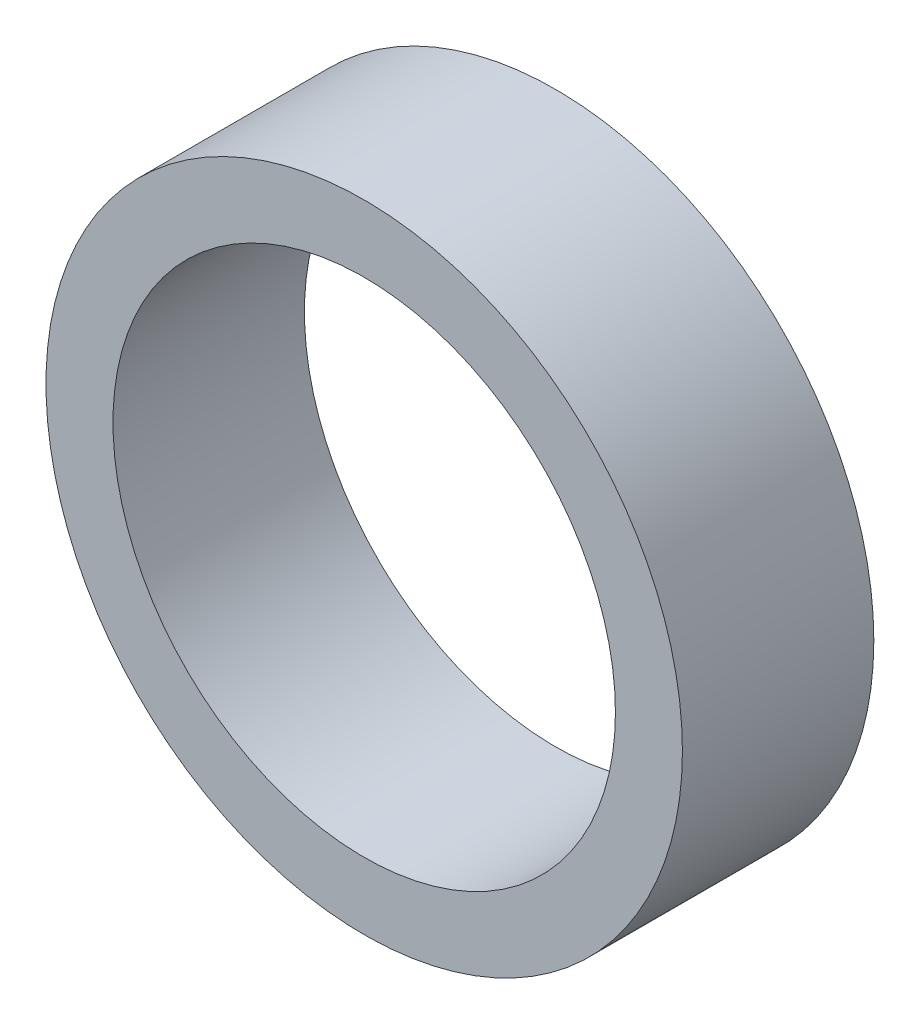
ISO-10303-21;
HEADER;
FILE_DESCRIPTION(('STEP AP214'),'2;1');
FILE_NAME('part.step','',(''),(''),'','','');
FILE_SCHEMA(('AUTOMOTIVE_DESIGN { 1 0 10303 214 1 1 1 1 }'));
ENDSEC;
DATA;
#1=APPLICATION_CONTEXT('core data for automotive mechanical design processes');
#2=APPLICATION_PROTOCOL_DEFINITION('international standard','automotive_design',2000,#1);
#3=PRODUCT_CONTEXT('',#1,'mechanical');
#4=PRODUCT('Part','Part','',(#3));
#5=PRODUCT_RELATED_PRODUCT_CATEGORY('part','',(#4));
#6=PRODUCT_DEFINITION_FORMATION('','',#4);
#7=PRODUCT_DEFINITION_CONTEXT('part definition',#1,'design');
#8=PRODUCT_DEFINITION('design','',#6,#7);
#9=PRODUCT_DEFINITION_SHAPE('','',#8);
#10=(LENGTH_UNIT() NAMED_UNIT(*) SI_UNIT(.MILLI.,.METRE.));
#11=(NAMED_UNIT(*) PLANE_ANGLE_UNIT() SI_UNIT($,.RADIAN.));
#12=(NAMED_UNIT(*) SI_UNIT($,.STERADIAN.) SOLID_ANGLE_UNIT());
#13=UNCERTAINTY_MEASURE_WITH_UNIT(LENGTH_MEASURE(1.E-05),#10,'distance_accuracy_value','');
#14=(GEOMETRIC_REPRESENTATION_CONTEXT(3) GLOBAL_UNCERTAINTY_ASSIGNED_CONTEXT((#13)) GLOBAL_UNIT_ASSIGNED_CONTEXT((#10,
#11,#12)) REPRESENTATION_CONTEXT('',''));
#15=CARTESIAN_POINT('',(0.,0.,0.));
#16=DIRECTION('',(0.,0.,1.));
#17=DIRECTION('',(1.,0.,0.));
#18=AXIS2_PLACEMENT_3D('',#15,#16,#17);
#19=CARTESIAN_POINT('',(33.,0.,10.));
#20=DIRECTION('',(0.,0.,1.));
#21=DIRECTION('',(1.,0.,0.));
#22=AXIS2_PLACEMENT_3D('',#19,#20,#21);
#23=PLANE('',#22);
#24=CARTESIAN_POINT('',(33.,0.,10.));
#25=DIRECTION('',(0.,0.,1.));
#26=DIRECTION('',(1.,0.,0.));
#27=AXIS2_PLACEMENT_3D('',#24,#25,#26);
#28=CIRCLE('',#27,3.325);
#29=CARTESIAN_POINT('',(36.325,0.,10.));
#30=VERTEX_POINT('',#29);
#31=EDGE_CURVE('E10',#30,#30,#28,.T.);
#32=ORIENTED_EDGE('',*,*,#31,.T.);
#33=EDGE_LOOP('',(#32));
#34=FACE_BOUND('',#33,.T.);
#35=CARTESIAN_POINT('',(33.,0.,10.));
#36=DIRECTION('',(0.,0.,1.));
#37=DIRECTION('',(1.,0.,0.));
#38=AXIS2_PLACEMENT_3D('',#35,#36,#37);
#39=CIRCLE('',#38,2.625);
#40=CARTESIAN_POINT('',(35.625,0.,10.));
#41=VERTEX_POINT('',#40);
#42=EDGE_CURVE('E48',#41,#41,#39,.T.);
#43=ORIENTED_EDGE('',*,*,#42,.F.);
#44=EDGE_LOOP('',(#43));
#45=FACE_BOUND('',#44,.T.);
#46=ADVANCED_FACE('F37',(#34,#45),#23,.T.);
#47=CARTESIAN_POINT('',(33.,0.,8.));
#48=DIRECTION('',(0.,0.,1.));
#49=DIRECTION('',(1.,0.,0.));
#50=AXIS2_PLACEMENT_3D('',#47,#48,#49);
#51=PLANE('',#50);
#52=CARTESIAN_POINT('',(33.,0.,8.));
#53=DIRECTION('',(0.,0.,1.));
#54=DIRECTION('',(1.,0.,0.));
#55=AXIS2_PLACEMENT_3D('',#52,#53,#54);
#56=CIRCLE('',#55,3.325);
#57=CARTESIAN_POINT('',(36.325,0.,8.));
#58=VERTEX_POINT('',#57);
#59=EDGE_CURVE('E41',#58,#58,#56,.T.);
#60=ORIENTED_EDGE('',*,*,#59,.F.);
#61=EDGE_LOOP('',(#60));
#62=FACE_BOUND('',#61,.T.);
#63=CARTESIAN_POINT('',(33.,0.,8.));
#64=DIRECTION('',(0.,0.,1.));
#65=DIRECTION('',(1.,0.,0.));
#66=AXIS2_PLACEMENT_3D('',#63,#64,#65);
#67=CIRCLE('',#66,2.625);
#68=CARTESIAN_POINT('',(35.625,0.,8.));
#69=VERTEX_POINT('',#68);
#70=EDGE_CURVE('E50',#69,#69,#67,.T.);
#71=ORIENTED_EDGE('',*,*,#70,.T.);
#72=EDGE_LOOP('',(#71));
#73=FACE_BOUND('',#72,.T.);
#74=ADVANCED_FACE('F60',(#62,#73),#51,.F.);
#75=CARTESIAN_POINT('',(33.,0.,10.));
#76=DIRECTION('',(0.,0.,-1.));
#77=DIRECTION('',(-1.,0.,0.));
#78=AXIS2_PLACEMENT_3D('',#75,#76,#77);
#79=CYLINDRICAL_SURFACE('',#78,3.325);
#80=ORIENTED_EDGE('',*,*,#31,.F.);
#81=EDGE_LOOP('',(#80));
#82=FACE_BOUND('',#81,.T.);
#83=ORIENTED_EDGE('',*,*,#59,.T.);
#84=EDGE_LOOP('',(#83));
#85=FACE_BOUND('',#84,.T.);
#86=ADVANCED_FACE('F39',(#82,#85),#79,.T.);
#87=CARTESIAN_POINT('',(33.,0.,10.));
#88=DIRECTION('',(0.,0.,-1.));
#89=DIRECTION('',(-1.,0.,0.));
#90=AXIS2_PLACEMENT_3D('',#87,#88,#89);
#91=CYLINDRICAL_SURFACE('',#90,2.625);
#92=ORIENTED_EDGE('',*,*,#42,.T.);
#93=EDGE_LOOP('',(#92));
#94=FACE_BOUND('',#93,.T.);
#95=ORIENTED_EDGE('',*,*,#70,.F.);
#96=EDGE_LOOP('',(#95));
#97=FACE_BOUND('',#96,.T.);
#98=ADVANCED_FACE('F56',(#94,#97),#91,.F.);
#99=CLOSED_SHELL('',(#46,#74,#86,#98));
#100=MANIFOLD_SOLID_BREP('B2',#99);
#101=ADVANCED_BREP_SHAPE_REPRESENTATION('',(#18,#100),#14);
#102=SHAPE_DEFINITION_REPRESENTATION(#9,#101);
ENDSEC;
END-ISO-10303-21;
